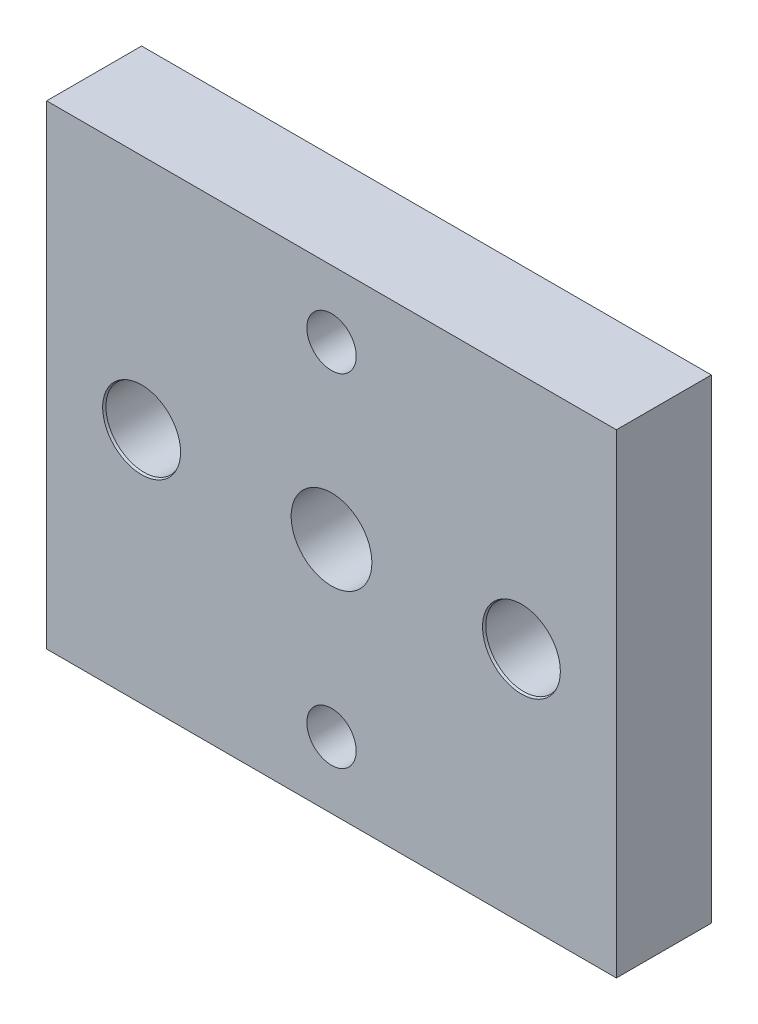
ISO-10303-21;
HEADER;
FILE_DESCRIPTION(('STEP AP214'),'2;1');
FILE_NAME('part.step','',(''),(''),'','','');
FILE_SCHEMA(('AUTOMOTIVE_DESIGN { 1 0 10303 214 1 1 1 1 }'));
ENDSEC;
DATA;
#1=APPLICATION_CONTEXT('core data for automotive mechanical design processes');
#2=APPLICATION_PROTOCOL_DEFINITION('international standard','automotive_design',2000,#1);
#3=PRODUCT_CONTEXT('',#1,'mechanical');
#4=PRODUCT('Part','Part','',(#3));
#5=PRODUCT_RELATED_PRODUCT_CATEGORY('part','',(#4));
#6=PRODUCT_DEFINITION_FORMATION('','',#4);
#7=PRODUCT_DEFINITION_CONTEXT('part definition',#1,'design');
#8=PRODUCT_DEFINITION('design','',#6,#7);
#9=PRODUCT_DEFINITION_SHAPE('','',#8);
#10=(LENGTH_UNIT() NAMED_UNIT(*) SI_UNIT(.MILLI.,.METRE.));
#11=(NAMED_UNIT(*) PLANE_ANGLE_UNIT() SI_UNIT($,.RADIAN.));
#12=(NAMED_UNIT(*) SI_UNIT($,.STERADIAN.) SOLID_ANGLE_UNIT());
#13=UNCERTAINTY_MEASURE_WITH_UNIT(LENGTH_MEASURE(1.E-05),#10,'distance_accuracy_value','');
#14=(GEOMETRIC_REPRESENTATION_CONTEXT(3) GLOBAL_UNCERTAINTY_ASSIGNED_CONTEXT((#13)) GLOBAL_UNIT_ASSIGNED_CONTEXT((#10,
#11,#12)) REPRESENTATION_CONTEXT('',''));
#15=CARTESIAN_POINT('',(0.,0.,0.));
#16=DIRECTION('',(0.,0.,1.));
#17=DIRECTION('',(1.,0.,0.));
#18=AXIS2_PLACEMENT_3D('',#15,#16,#17);
#19=CARTESIAN_POINT('',(30.,-25.,10.));
#20=DIRECTION('',(-1.,0.,0.));
#21=DIRECTION('',(0.,0.,1.));
#22=AXIS2_PLACEMENT_3D('',#19,#20,#21);
#23=PLANE('',#22);
#24=DIRECTION('',(0.,1.,0.));
#25=VECTOR('',#24,1.);
#26=CARTESIAN_POINT('',(30.,-25.,0.));
#27=LINE('',#26,#25);
#28=CARTESIAN_POINT('',(30.,-25.,0.));
#29=VERTEX_POINT('',#28);
#30=CARTESIAN_POINT('',(30.,25.,0.));
#31=VERTEX_POINT('',#30);
#32=EDGE_CURVE('E106',#29,#31,#27,.T.);
#33=ORIENTED_EDGE('',*,*,#32,.T.);
#34=DIRECTION('',(0.,0.,-1.));
#35=VECTOR('',#34,1.);
#36=CARTESIAN_POINT('',(30.,25.,10.));
#37=LINE('',#36,#35);
#38=CARTESIAN_POINT('',(30.,25.,10.));
#39=VERTEX_POINT('',#38);
#40=EDGE_CURVE('E11',#39,#31,#37,.T.);
#41=ORIENTED_EDGE('',*,*,#40,.F.);
#42=DIRECTION('',(0.,1.,0.));
#43=VECTOR('',#42,1.);
#44=CARTESIAN_POINT('',(30.,-25.,10.));
#45=LINE('',#44,#43);
#46=CARTESIAN_POINT('',(30.,-25.,10.));
#47=VERTEX_POINT('',#46);
#48=EDGE_CURVE('E90',#47,#39,#45,.T.);
#49=ORIENTED_EDGE('',*,*,#48,.F.);
#50=DIRECTION('',(0.,0.,-1.));
#51=VECTOR('',#50,1.);
#52=CARTESIAN_POINT('',(30.,-25.,10.));
#53=LINE('',#52,#51);
#54=EDGE_CURVE('E102',#47,#29,#53,.T.);
#55=ORIENTED_EDGE('',*,*,#54,.T.);
#56=EDGE_LOOP('',(#33,#41,#49,#55));
#57=FACE_BOUND('',#56,.T.);
#58=ADVANCED_FACE('F38',(#57),#23,.F.);
#59=CARTESIAN_POINT('',(-30.,25.,10.));
#60=DIRECTION('',(0.,-1.,0.));
#61=DIRECTION('',(0.,0.,-1.));
#62=AXIS2_PLACEMENT_3D('',#59,#60,#61);
#63=PLANE('',#62);
#64=DIRECTION('',(-1.,0.,0.));
#65=VECTOR('',#64,1.);
#66=CARTESIAN_POINT('',(-30.,25.,0.));
#67=LINE('',#66,#65);
#68=CARTESIAN_POINT('',(-30.,25.,0.));
#69=VERTEX_POINT('',#68);
#70=EDGE_CURVE('E95',#31,#69,#67,.T.);
#71=ORIENTED_EDGE('',*,*,#70,.T.);
#72=DIRECTION('',(0.,0.,-1.));
#73=VECTOR('',#72,1.);
#74=CARTESIAN_POINT('',(-30.,25.,10.));
#75=LINE('',#74,#73);
#76=CARTESIAN_POINT('',(-30.,25.,10.));
#77=VERTEX_POINT('',#76);
#78=EDGE_CURVE('E47',#77,#69,#75,.T.);
#79=ORIENTED_EDGE('',*,*,#78,.F.);
#80=DIRECTION('',(-1.,0.,0.));
#81=VECTOR('',#80,1.);
#82=CARTESIAN_POINT('',(-30.,25.,10.));
#83=LINE('',#82,#81);
#84=EDGE_CURVE('E85',#39,#77,#83,.T.);
#85=ORIENTED_EDGE('',*,*,#84,.F.);
#86=ORIENTED_EDGE('',*,*,#40,.T.);
#87=EDGE_LOOP('',(#71,#79,#85,#86));
#88=FACE_BOUND('',#87,.T.);
#89=ADVANCED_FACE('F94',(#88),#63,.F.);
#90=CARTESIAN_POINT('',(-30.,-25.,10.));
#91=DIRECTION('',(1.,0.,0.));
#92=DIRECTION('',(0.,0.,-1.));
#93=AXIS2_PLACEMENT_3D('',#90,#91,#92);
#94=PLANE('',#93);
#95=DIRECTION('',(0.,-1.,0.));
#96=VECTOR('',#95,1.);
#97=CARTESIAN_POINT('',(-30.,-25.,0.));
#98=LINE('',#97,#96);
#99=CARTESIAN_POINT('',(-30.,-25.,0.));
#100=VERTEX_POINT('',#99);
#101=EDGE_CURVE('E72',#69,#100,#98,.T.);
#102=ORIENTED_EDGE('',*,*,#101,.T.);
#103=DIRECTION('',(0.,0.,-1.));
#104=VECTOR('',#103,1.);
#105=CARTESIAN_POINT('',(-30.,-25.,10.));
#106=LINE('',#105,#104);
#107=CARTESIAN_POINT('',(-30.,-25.,10.));
#108=VERTEX_POINT('',#107);
#109=EDGE_CURVE('E97',#108,#100,#106,.T.);
#110=ORIENTED_EDGE('',*,*,#109,.F.);
#111=DIRECTION('',(0.,-1.,0.));
#112=VECTOR('',#111,1.);
#113=CARTESIAN_POINT('',(-30.,-25.,10.));
#114=LINE('',#113,#112);
#115=EDGE_CURVE('E88',#77,#108,#114,.T.);
#116=ORIENTED_EDGE('',*,*,#115,.F.);
#117=ORIENTED_EDGE('',*,*,#78,.T.);
#118=EDGE_LOOP('',(#102,#110,#116,#117));
#119=FACE_BOUND('',#118,.T.);
#120=ADVANCED_FACE('F98',(#119),#94,.F.);
#121=CARTESIAN_POINT('',(-30.,-25.,10.));
#122=DIRECTION('',(0.,1.,0.));
#123=DIRECTION('',(0.,0.,1.));
#124=AXIS2_PLACEMENT_3D('',#121,#122,#123);
#125=PLANE('',#124);
#126=DIRECTION('',(1.,0.,0.));
#127=VECTOR('',#126,1.);
#128=CARTESIAN_POINT('',(-30.,-25.,0.));
#129=LINE('',#128,#127);
#130=EDGE_CURVE('E78',#100,#29,#129,.T.);
#131=ORIENTED_EDGE('',*,*,#130,.T.);
#132=ORIENTED_EDGE('',*,*,#54,.F.);
#133=DIRECTION('',(1.,0.,0.));
#134=VECTOR('',#133,1.);
#135=CARTESIAN_POINT('',(-30.,-25.,10.));
#136=LINE('',#135,#134);
#137=EDGE_CURVE('E55',#108,#47,#136,.T.);
#138=ORIENTED_EDGE('',*,*,#137,.F.);
#139=ORIENTED_EDGE('',*,*,#109,.T.);
#140=EDGE_LOOP('',(#131,#132,#138,#139));
#141=FACE_BOUND('',#140,.T.);
#142=ADVANCED_FACE('F120',(#141),#125,.F.);
#143=CARTESIAN_POINT('',(0.,0.,10.));
#144=DIRECTION('',(0.,0.,-1.));
#145=DIRECTION('',(-1.,0.,0.));
#146=AXIS2_PLACEMENT_3D('',#143,#144,#145);
#147=PLANE('',#146);
#148=CARTESIAN_POINT('',(0.,18.,10.));
#149=DIRECTION('',(0.,0.,-1.));
#150=DIRECTION('',(-1.,0.,0.));
#151=AXIS2_PLACEMENT_3D('',#148,#149,#150);
#152=CIRCLE('',#151,2.60000000000001);
#153=CARTESIAN_POINT('',(-2.60000000000001,18.,10.));
#154=VERTEX_POINT('',#153);
#155=EDGE_CURVE('E166',#154,#154,#152,.T.);
#156=ORIENTED_EDGE('',*,*,#155,.T.);
#157=EDGE_LOOP('',(#156));
#158=FACE_BOUND('',#157,.T.);
#159=CARTESIAN_POINT('',(0.,-18.,10.));
#160=DIRECTION('',(0.,0.,-1.));
#161=DIRECTION('',(-1.,0.,0.));
#162=AXIS2_PLACEMENT_3D('',#159,#160,#161);
#163=CIRCLE('',#162,2.60000000000001);
#164=CARTESIAN_POINT('',(-2.60000000000001,-18.,10.));
#165=VERTEX_POINT('',#164);
#166=EDGE_CURVE('E158',#165,#165,#163,.T.);
#167=ORIENTED_EDGE('',*,*,#166,.T.);
#168=EDGE_LOOP('',(#167));
#169=FACE_BOUND('',#168,.T.);
#170=CARTESIAN_POINT('',(20.,0.,10.));
#171=DIRECTION('',(0.,0.,1.));
#172=DIRECTION('',(1.,0.,0.));
#173=AXIS2_PLACEMENT_3D('',#170,#171,#172);
#174=CIRCLE('',#173,4.1);
#175=CARTESIAN_POINT('',(24.1,0.,10.));
#176=VERTEX_POINT('',#175);
#177=EDGE_CURVE('E154',#176,#176,#174,.T.);
#178=ORIENTED_EDGE('',*,*,#177,.F.);
#179=EDGE_LOOP('',(#178));
#180=FACE_BOUND('',#179,.T.);
#181=CARTESIAN_POINT('',(-20.,0.,10.));
#182=DIRECTION('',(0.,0.,1.));
#183=DIRECTION('',(1.,0.,0.));
#184=AXIS2_PLACEMENT_3D('',#181,#182,#183);
#185=CIRCLE('',#184,4.1);
#186=CARTESIAN_POINT('',(-15.9,0.,10.));
#187=VERTEX_POINT('',#186);
#188=EDGE_CURVE('E142',#187,#187,#185,.T.);
#189=ORIENTED_EDGE('',*,*,#188,.F.);
#190=EDGE_LOOP('',(#189));
#191=FACE_BOUND('',#190,.T.);
#192=CARTESIAN_POINT('',(0.,0.,10.));
#193=DIRECTION('',(0.,0.,1.));
#194=DIRECTION('',(1.,0.,0.));
#195=AXIS2_PLACEMENT_3D('',#192,#193,#194);
#196=CIRCLE('',#195,4.25000000000002);
#197=CARTESIAN_POINT('',(4.25000000000002,0.,10.));
#198=VERTEX_POINT('',#197);
#199=EDGE_CURVE('E130',#198,#198,#196,.T.);
#200=ORIENTED_EDGE('',*,*,#199,.F.);
#201=EDGE_LOOP('',(#200));
#202=FACE_BOUND('',#201,.T.);
#203=ORIENTED_EDGE('',*,*,#48,.T.);
#204=ORIENTED_EDGE('',*,*,#84,.T.);
#205=ORIENTED_EDGE('',*,*,#115,.T.);
#206=ORIENTED_EDGE('',*,*,#137,.T.);
#207=EDGE_LOOP('',(#203,#204,#205,#206));
#208=FACE_BOUND('',#207,.T.);
#209=ADVANCED_FACE('F86',(#158,#169,#180,#191,#202,#208),#147,.F.);
#210=CARTESIAN_POINT('',(0.,0.,0.));
#211=DIRECTION('',(0.,0.,-1.));
#212=DIRECTION('',(-1.,0.,0.));
#213=AXIS2_PLACEMENT_3D('',#210,#211,#212);
#214=PLANE('',#213);
#215=CARTESIAN_POINT('',(0.,18.,0.));
#216=DIRECTION('',(0.,0.,-1.));
#217=DIRECTION('',(-1.,0.,0.));
#218=AXIS2_PLACEMENT_3D('',#215,#216,#217);
#219=CIRCLE('',#218,2.60000000000001);
#220=CARTESIAN_POINT('',(-2.60000000000001,18.,0.));
#221=VERTEX_POINT('',#220);
#222=EDGE_CURVE('E170',#221,#221,#219,.T.);
#223=ORIENTED_EDGE('',*,*,#222,.F.);
#224=EDGE_LOOP('',(#223));
#225=FACE_BOUND('',#224,.T.);
#226=CARTESIAN_POINT('',(0.,-18.,0.));
#227=DIRECTION('',(0.,0.,-1.));
#228=DIRECTION('',(-1.,0.,0.));
#229=AXIS2_PLACEMENT_3D('',#226,#227,#228);
#230=CIRCLE('',#229,2.60000000000001);
#231=CARTESIAN_POINT('',(-2.60000000000001,-18.,0.));
#232=VERTEX_POINT('',#231);
#233=EDGE_CURVE('E162',#232,#232,#230,.T.);
#234=ORIENTED_EDGE('',*,*,#233,.F.);
#235=EDGE_LOOP('',(#234));
#236=FACE_BOUND('',#235,.T.);
#237=CARTESIAN_POINT('',(20.,0.,0.));
#238=DIRECTION('',(0.,0.,1.));
#239=DIRECTION('',(1.,0.,0.));
#240=AXIS2_PLACEMENT_3D('',#237,#238,#239);
#241=CIRCLE('',#240,4.);
#242=CARTESIAN_POINT('',(24.,0.,0.));
#243=VERTEX_POINT('',#242);
#244=EDGE_CURVE('E146',#243,#243,#241,.T.);
#245=ORIENTED_EDGE('',*,*,#244,.T.);
#246=EDGE_LOOP('',(#245));
#247=FACE_BOUND('',#246,.T.);
#248=CARTESIAN_POINT('',(-20.,0.,0.));
#249=DIRECTION('',(0.,0.,1.));
#250=DIRECTION('',(1.,0.,0.));
#251=AXIS2_PLACEMENT_3D('',#248,#249,#250);
#252=CIRCLE('',#251,4.);
#253=CARTESIAN_POINT('',(-16.,0.,0.));
#254=VERTEX_POINT('',#253);
#255=EDGE_CURVE('E134',#254,#254,#252,.T.);
#256=ORIENTED_EDGE('',*,*,#255,.T.);
#257=EDGE_LOOP('',(#256));
#258=FACE_BOUND('',#257,.T.);
#259=CARTESIAN_POINT('',(0.,0.,0.));
#260=DIRECTION('',(0.,0.,-1.));
#261=DIRECTION('',(-1.,0.,0.));
#262=AXIS2_PLACEMENT_3D('',#259,#260,#261);
#263=CIRCLE('',#262,4.25000000000001);
#264=CARTESIAN_POINT('',(-4.25000000000001,0.,0.));
#265=VERTEX_POINT('',#264);
#266=EDGE_CURVE('E110',#265,#265,#263,.T.);
#267=ORIENTED_EDGE('',*,*,#266,.F.);
#268=EDGE_LOOP('',(#267));
#269=FACE_BOUND('',#268,.T.);
#270=ORIENTED_EDGE('',*,*,#32,.F.);
#271=ORIENTED_EDGE('',*,*,#130,.F.);
#272=ORIENTED_EDGE('',*,*,#101,.F.);
#273=ORIENTED_EDGE('',*,*,#70,.F.);
#274=EDGE_LOOP('',(#270,#271,#272,#273));
#275=FACE_BOUND('',#274,.T.);
#276=ADVANCED_FACE('F123',(#225,#236,#247,#258,#269,#275),#214,.T.);
#277=CARTESIAN_POINT('',(0.,0.,10.));
#278=DIRECTION('',(0.,0.,1.));
#279=DIRECTION('',(1.,0.,0.));
#280=AXIS2_PLACEMENT_3D('',#277,#278,#279);
#281=CYLINDRICAL_SURFACE('',#280,4.25000000000001);
#282=ORIENTED_EDGE('',*,*,#266,.T.);
#283=EDGE_LOOP('',(#282));
#284=FACE_BOUND('',#283,.T.);
#285=ORIENTED_EDGE('',*,*,#199,.T.);
#286=EDGE_LOOP('',(#285));
#287=FACE_BOUND('',#286,.T.);
#288=ADVANCED_FACE('F179',(#284,#287),#281,.F.);
#289=CARTESIAN_POINT('',(-20.,0.,10.));
#290=DIRECTION('',(0.,0.,1.));
#291=DIRECTION('',(1.,0.,0.));
#292=AXIS2_PLACEMENT_3D('',#289,#290,#291);
#293=CYLINDRICAL_SURFACE('',#292,4.00000000000001);
#294=ORIENTED_EDGE('',*,*,#255,.F.);
#295=EDGE_LOOP('',(#294));
#296=FACE_BOUND('',#295,.T.);
#297=CARTESIAN_POINT('',(-20.,0.,9.75857864376273));
#298=DIRECTION('',(0.,0.,1.));
#299=DIRECTION('',(1.,0.,0.));
#300=AXIS2_PLACEMENT_3D('',#297,#298,#299);
#301=CIRCLE('',#300,4.00000000000001);
#302=CARTESIAN_POINT('',(-16.,0.,9.75857864376273));
#303=VERTEX_POINT('',#302);
#304=EDGE_CURVE('E138',#303,#303,#301,.T.);
#305=ORIENTED_EDGE('',*,*,#304,.T.);
#306=EDGE_LOOP('',(#305));
#307=FACE_BOUND('',#306,.T.);
#308=ADVANCED_FACE('F191',(#296,#307),#293,.F.);
#309=CARTESIAN_POINT('',(-20.,0.,10.));
#310=DIRECTION('',(0.,0.,1.));
#311=DIRECTION('',(1.,0.,0.));
#312=AXIS2_PLACEMENT_3D('',#309,#310,#311);
#313=CONICAL_SURFACE('',#312,4.1,0.392699081698732);
#314=ORIENTED_EDGE('',*,*,#304,.F.);
#315=EDGE_LOOP('',(#314));
#316=FACE_BOUND('',#315,.T.);
#317=ORIENTED_EDGE('',*,*,#188,.T.);
#318=EDGE_LOOP('',(#317));
#319=FACE_BOUND('',#318,.T.);
#320=ADVANCED_FACE('F234',(#316,#319),#313,.F.);
#321=CARTESIAN_POINT('',(20.,0.,10.));
#322=DIRECTION('',(0.,0.,1.));
#323=DIRECTION('',(1.,0.,0.));
#324=AXIS2_PLACEMENT_3D('',#321,#322,#323);
#325=CYLINDRICAL_SURFACE('',#324,4.00000000000001);
#326=ORIENTED_EDGE('',*,*,#244,.F.);
#327=EDGE_LOOP('',(#326));
#328=FACE_BOUND('',#327,.T.);
#329=CARTESIAN_POINT('',(20.,0.,9.75857864376273));
#330=DIRECTION('',(0.,0.,1.));
#331=DIRECTION('',(1.,0.,0.));
#332=AXIS2_PLACEMENT_3D('',#329,#330,#331);
#333=CIRCLE('',#332,4.00000000000001);
#334=CARTESIAN_POINT('',(24.,0.,9.75857864376273));
#335=VERTEX_POINT('',#334);
#336=EDGE_CURVE('E150',#335,#335,#333,.T.);
#337=ORIENTED_EDGE('',*,*,#336,.T.);
#338=EDGE_LOOP('',(#337));
#339=FACE_BOUND('',#338,.T.);
#340=ADVANCED_FACE('F244',(#328,#339),#325,.F.);
#341=CARTESIAN_POINT('',(20.,0.,10.));
#342=DIRECTION('',(0.,0.,1.));
#343=DIRECTION('',(1.,0.,0.));
#344=AXIS2_PLACEMENT_3D('',#341,#342,#343);
#345=CONICAL_SURFACE('',#344,4.1,0.392699081698732);
#346=ORIENTED_EDGE('',*,*,#336,.F.);
#347=EDGE_LOOP('',(#346));
#348=FACE_BOUND('',#347,.T.);
#349=ORIENTED_EDGE('',*,*,#177,.T.);
#350=EDGE_LOOP('',(#349));
#351=FACE_BOUND('',#350,.T.);
#352=ADVANCED_FACE('F254',(#348,#351),#345,.F.);
#353=CARTESIAN_POINT('',(0.,-18.,0.));
#354=DIRECTION('',(0.,0.,-1.));
#355=DIRECTION('',(-1.,0.,0.));
#356=AXIS2_PLACEMENT_3D('',#353,#354,#355);
#357=CYLINDRICAL_SURFACE('',#356,2.60000000000001);
#358=ORIENTED_EDGE('',*,*,#166,.F.);
#359=EDGE_LOOP('',(#358));
#360=FACE_BOUND('',#359,.T.);
#361=ORIENTED_EDGE('',*,*,#233,.T.);
#362=EDGE_LOOP('',(#361));
#363=FACE_BOUND('',#362,.T.);
#364=ADVANCED_FACE('F263',(#360,#363),#357,.F.);
#365=CARTESIAN_POINT('',(0.,18.,0.));
#366=DIRECTION('',(0.,0.,-1.));
#367=DIRECTION('',(-1.,0.,0.));
#368=AXIS2_PLACEMENT_3D('',#365,#366,#367);
#369=CYLINDRICAL_SURFACE('',#368,2.60000000000001);
#370=ORIENTED_EDGE('',*,*,#155,.F.);
#371=EDGE_LOOP('',(#370));
#372=FACE_BOUND('',#371,.T.);
#373=ORIENTED_EDGE('',*,*,#222,.T.);
#374=EDGE_LOOP('',(#373));
#375=FACE_BOUND('',#374,.T.);
#376=ADVANCED_FACE('F175',(#372,#375),#369,.F.);
#377=CLOSED_SHELL('',(#58,#89,#120,#142,#209,#276,#288,#308,#320,#340,#352,#364,#376));
#378=MANIFOLD_SOLID_BREP('B2',#377);
#379=ADVANCED_BREP_SHAPE_REPRESENTATION('',(#18,#378),#14);
#380=SHAPE_DEFINITION_REPRESENTATION(#9,#379);
ENDSEC;
END-ISO-10303-21;
